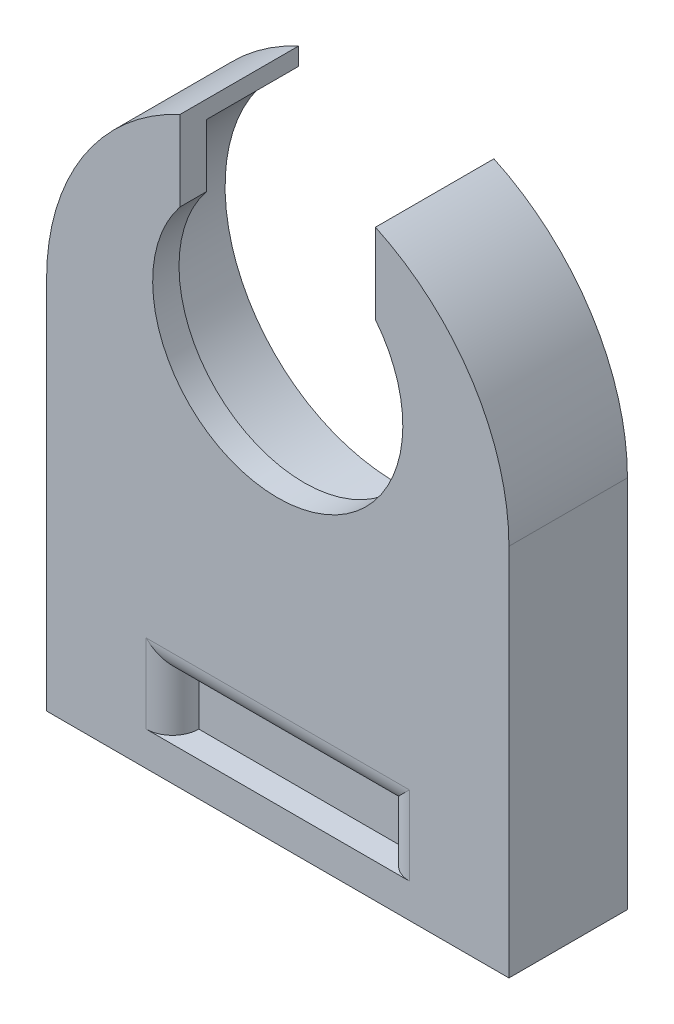
ISO-10303-21;
HEADER;
FILE_DESCRIPTION(('STEP AP214'),'2;1');
FILE_NAME('part.step','',(''),(''),'','','');
FILE_SCHEMA(('AUTOMOTIVE_DESIGN { 1 0 10303 214 1 1 1 1 }'));
ENDSEC;
DATA;
#1=APPLICATION_CONTEXT('core data for automotive mechanical design processes');
#2=APPLICATION_PROTOCOL_DEFINITION('international standard','automotive_design',2000,#1);
#3=PRODUCT_CONTEXT('',#1,'mechanical');
#4=PRODUCT('Part','Part','',(#3));
#5=PRODUCT_RELATED_PRODUCT_CATEGORY('part','',(#4));
#6=PRODUCT_DEFINITION_FORMATION('','',#4);
#7=PRODUCT_DEFINITION_CONTEXT('part definition',#1,'design');
#8=PRODUCT_DEFINITION('design','',#6,#7);
#9=PRODUCT_DEFINITION_SHAPE('','',#8);
#10=(LENGTH_UNIT() NAMED_UNIT(*) SI_UNIT(.MILLI.,.METRE.));
#11=(NAMED_UNIT(*) PLANE_ANGLE_UNIT() SI_UNIT($,.RADIAN.));
#12=(NAMED_UNIT(*) SI_UNIT($,.STERADIAN.) SOLID_ANGLE_UNIT());
#13=UNCERTAINTY_MEASURE_WITH_UNIT(LENGTH_MEASURE(1.E-05),#10,'distance_accuracy_value','');
#14=(GEOMETRIC_REPRESENTATION_CONTEXT(3) GLOBAL_UNCERTAINTY_ASSIGNED_CONTEXT((#13)) GLOBAL_UNIT_ASSIGNED_CONTEXT((#10,
#11,#12)) REPRESENTATION_CONTEXT('',''));
#15=CARTESIAN_POINT('',(0.,0.,0.));
#16=DIRECTION('',(0.,0.,1.));
#17=DIRECTION('',(1.,0.,0.));
#18=AXIS2_PLACEMENT_3D('',#15,#16,#17);
#19=CARTESIAN_POINT('',(8.78,8.5,3.5));
#20=DIRECTION('',(0.,0.,-1.));
#21=DIRECTION('',(-1.,0.,0.));
#22=AXIS2_PLACEMENT_3D('',#19,#20,#21);
#23=CYLINDRICAL_SURFACE('',#22,6.5);
#24=CARTESIAN_POINT('',(8.78,8.5,3.5));
#25=DIRECTION('',(0.,0.,1.));
#26=DIRECTION('',(1.,0.,0.));
#27=AXIS2_PLACEMENT_3D('',#24,#25,#26);
#28=CIRCLE('',#27,6.5);
#29=CARTESIAN_POINT('',(5.07,13.8372183766453,3.5));
#30=VERTEX_POINT('',#29);
#31=CARTESIAN_POINT('',(12.49,13.8372183766453,3.5));
#32=VERTEX_POINT('',#31);
#33=EDGE_CURVE('E150',#30,#32,#28,.T.);
#34=ORIENTED_EDGE('',*,*,#33,.T.);
#35=DIRECTION('',(0.,0.,-1.));
#36=VECTOR('',#35,1.);
#37=CARTESIAN_POINT('',(12.49,13.8372183766453,3.5));
#38=LINE('',#37,#36);
#39=CARTESIAN_POINT('',(12.49,13.8372183766453,0.));
#40=VERTEX_POINT('',#39);
#41=EDGE_CURVE('E136',#32,#40,#38,.T.);
#42=ORIENTED_EDGE('',*,*,#41,.T.);
#43=CARTESIAN_POINT('',(8.78,8.5,0.));
#44=DIRECTION('',(0.,0.,1.));
#45=DIRECTION('',(1.,0.,0.));
#46=AXIS2_PLACEMENT_3D('',#43,#44,#45);
#47=CIRCLE('',#46,6.5);
#48=CARTESIAN_POINT('',(5.07,13.8372183766453,0.));
#49=VERTEX_POINT('',#48);
#50=EDGE_CURVE('E148',#49,#40,#47,.T.);
#51=ORIENTED_EDGE('',*,*,#50,.F.);
#52=DIRECTION('',(0.,0.,-1.));
#53=VECTOR('',#52,1.);
#54=CARTESIAN_POINT('',(5.07,13.8372183766453,3.5));
#55=LINE('',#54,#53);
#56=EDGE_CURVE('E210',#49,#30,#55,.F.);
#57=ORIENTED_EDGE('',*,*,#56,.T.);
#58=EDGE_LOOP('',(#34,#42,#51,#57));
#59=FACE_BOUND('',#58,.T.);
#60=ADVANCED_FACE('F34',(#59),#23,.F.);
#61=CARTESIAN_POINT('',(0.,0.,0.));
#62=DIRECTION('',(0.,0.,1.));
#63=DIRECTION('',(1.,0.,0.));
#64=AXIS2_PLACEMENT_3D('',#61,#62,#63);
#65=PLANE('',#64);
#66=DIRECTION('',(0.,1.,0.));
#67=VECTOR('',#66,1.);
#68=CARTESIAN_POINT('',(12.49,14.6194981256581,0.));
#69=LINE('',#68,#67);
#70=CARTESIAN_POINT('',(12.49,14.5076566902575,0.));
#71=VERTEX_POINT('',#70);
#72=EDGE_CURVE('E133',#40,#71,#69,.T.);
#73=ORIENTED_EDGE('',*,*,#72,.T.);
#74=CARTESIAN_POINT('',(8.78,6.55,0.));
#75=DIRECTION('',(0.,0.,1.));
#76=DIRECTION('',(1.,0.,0.));
#77=AXIS2_PLACEMENT_3D('',#74,#75,#76);
#78=CIRCLE('',#77,8.78);
#79=CARTESIAN_POINT('',(17.56,6.55,0.));
#80=VERTEX_POINT('',#79);
#81=EDGE_CURVE('E172',#80,#71,#78,.T.);
#82=ORIENTED_EDGE('',*,*,#81,.F.);
#83=DIRECTION('',(0.,1.,0.));
#84=VECTOR('',#83,1.);
#85=CARTESIAN_POINT('',(17.56,0.,0.));
#86=LINE('',#85,#84);
#87=CARTESIAN_POINT('',(17.56,-7.65,0.));
#88=VERTEX_POINT('',#87);
#89=EDGE_CURVE('E170',#88,#80,#86,.T.);
#90=ORIENTED_EDGE('',*,*,#89,.F.);
#91=DIRECTION('',(1.,0.,0.));
#92=VECTOR('',#91,1.);
#93=CARTESIAN_POINT('',(0.,-7.65,0.));
#94=LINE('',#93,#92);
#95=CARTESIAN_POINT('',(0.,-7.65,0.));
#96=VERTEX_POINT('',#95);
#97=EDGE_CURVE('E234',#96,#88,#94,.T.);
#98=ORIENTED_EDGE('',*,*,#97,.F.);
#99=DIRECTION('',(0.,1.,0.));
#100=VECTOR('',#99,1.);
#101=CARTESIAN_POINT('',(0.,0.,0.));
#102=LINE('',#101,#100);
#103=CARTESIAN_POINT('',(0.,6.55,0.));
#104=VERTEX_POINT('',#103);
#105=EDGE_CURVE('E161',#96,#104,#102,.T.);
#106=ORIENTED_EDGE('',*,*,#105,.T.);
#107=CARTESIAN_POINT('',(8.78,6.55,0.));
#108=DIRECTION('',(0.,0.,1.));
#109=DIRECTION('',(1.,0.,0.));
#110=AXIS2_PLACEMENT_3D('',#107,#108,#109);
#111=CIRCLE('',#110,8.78);
#112=CARTESIAN_POINT('',(5.07,14.5076566902575,0.));
#113=VERTEX_POINT('',#112);
#114=EDGE_CURVE('E158',#113,#104,#111,.T.);
#115=ORIENTED_EDGE('',*,*,#114,.F.);
#116=DIRECTION('',(0.,1.,0.));
#117=VECTOR('',#116,1.);
#118=CARTESIAN_POINT('',(5.07,14.6194981256581,0.));
#119=LINE('',#118,#117);
#120=EDGE_CURVE('E157',#49,#113,#119,.T.);
#121=ORIENTED_EDGE('',*,*,#120,.F.);
#122=ORIENTED_EDGE('',*,*,#50,.T.);
#123=EDGE_LOOP('',(#73,#82,#90,#98,#106,#115,#121,#122));
#124=FACE_BOUND('',#123,.T.);
#125=ADVANCED_FACE('F155',(#124),#65,.F.);
#126=CARTESIAN_POINT('',(0.,0.,3.5));
#127=DIRECTION('',(0.,0.,1.));
#128=DIRECTION('',(1.,0.,0.));
#129=AXIS2_PLACEMENT_3D('',#126,#127,#128);
#130=PLANE('',#129);
#131=DIRECTION('',(0.,-1.,0.));
#132=VECTOR('',#131,1.);
#133=CARTESIAN_POINT('',(12.49,0.,3.5));
#134=LINE('',#133,#132);
#135=CARTESIAN_POINT('',(12.49,11.466209702634,3.5));
#136=VERTEX_POINT('',#135);
#137=EDGE_CURVE('E152',#32,#136,#134,.T.);
#138=ORIENTED_EDGE('',*,*,#137,.F.);
#139=ORIENTED_EDGE('',*,*,#33,.F.);
#140=DIRECTION('',(0.,1.,0.));
#141=VECTOR('',#140,1.);
#142=CARTESIAN_POINT('',(5.07,0.,3.5));
#143=LINE('',#142,#141);
#144=CARTESIAN_POINT('',(5.07,11.466209702634,3.5));
#145=VERTEX_POINT('',#144);
#146=EDGE_CURVE('E204',#145,#30,#143,.T.);
#147=ORIENTED_EDGE('',*,*,#146,.F.);
#148=CARTESIAN_POINT('',(8.78,8.5,3.5));
#149=DIRECTION('',(0.,0.,-1.));
#150=DIRECTION('',(-1.,0.,0.));
#151=AXIS2_PLACEMENT_3D('',#148,#149,#150);
#152=CIRCLE('',#151,4.75);
#153=EDGE_CURVE('E209',#136,#145,#152,.T.);
#154=ORIENTED_EDGE('',*,*,#153,.F.);
#155=EDGE_LOOP('',(#138,#139,#147,#154));
#156=FACE_BOUND('',#155,.T.);
#157=ADVANCED_FACE('F208',(#156),#130,.F.);
#158=CARTESIAN_POINT('',(0.,0.,4.5));
#159=DIRECTION('',(0.,0.,1.));
#160=DIRECTION('',(1.,0.,0.));
#161=AXIS2_PLACEMENT_3D('',#158,#159,#160);
#162=PLANE('',#161);
#163=DIRECTION('',(0.,1.,0.));
#164=VECTOR('',#163,1.);
#165=CARTESIAN_POINT('',(13.78,-6.35316683145248,4.5));
#166=LINE('',#165,#164);
#167=CARTESIAN_POINT('',(13.78,-3.35316683145248,4.5));
#168=VERTEX_POINT('',#167);
#169=CARTESIAN_POINT('',(13.78,-6.35316683145248,4.5));
#170=VERTEX_POINT('',#169);
#171=EDGE_CURVE('E182',#168,#170,#166,.F.);
#172=ORIENTED_EDGE('',*,*,#171,.T.);
#173=DIRECTION('',(1.,0.,0.));
#174=VECTOR('',#173,1.);
#175=CARTESIAN_POINT('',(12.78,-6.35316683145248,4.5));
#176=LINE('',#175,#174);
#177=CARTESIAN_POINT('',(3.78,-6.35316683145248,4.5));
#178=VERTEX_POINT('',#177);
#179=EDGE_CURVE('E198',#178,#170,#176,.T.);
#180=ORIENTED_EDGE('',*,*,#179,.F.);
#181=DIRECTION('',(0.,-1.,0.));
#182=VECTOR('',#181,1.);
#183=CARTESIAN_POINT('',(3.78,-4.35316683145248,4.5));
#184=LINE('',#183,#182);
#185=CARTESIAN_POINT('',(3.78,-3.35316683145248,4.5));
#186=VERTEX_POINT('',#185);
#187=EDGE_CURVE('E185',#178,#186,#184,.F.);
#188=ORIENTED_EDGE('',*,*,#187,.T.);
#189=DIRECTION('',(-1.,0.,0.));
#190=VECTOR('',#189,1.);
#191=CARTESIAN_POINT('',(12.78,-3.35316683145248,4.5));
#192=LINE('',#191,#190);
#193=EDGE_CURVE('E180',#186,#168,#192,.F.);
#194=ORIENTED_EDGE('',*,*,#193,.T.);
#195=EDGE_LOOP('',(#172,#180,#188,#194));
#196=FACE_BOUND('',#195,.T.);
#197=CARTESIAN_POINT('',(8.78,6.55,4.5));
#198=DIRECTION('',(0.,0.,1.));
#199=DIRECTION('',(1.,0.,0.));
#200=AXIS2_PLACEMENT_3D('',#197,#198,#199);
#201=CIRCLE('',#200,8.78);
#202=CARTESIAN_POINT('',(17.56,6.55,4.5));
#203=VERTEX_POINT('',#202);
#204=CARTESIAN_POINT('',(12.49,14.5076566902575,4.5));
#205=VERTEX_POINT('',#204);
#206=EDGE_CURVE('E241',#203,#205,#201,.T.);
#207=ORIENTED_EDGE('',*,*,#206,.T.);
#208=DIRECTION('',(0.,-1.,0.));
#209=VECTOR('',#208,1.);
#210=CARTESIAN_POINT('',(12.49,14.6194981256581,4.5));
#211=LINE('',#210,#209);
#212=CARTESIAN_POINT('',(12.49,11.466209702634,4.5));
#213=VERTEX_POINT('',#212);
#214=EDGE_CURVE('E48',#205,#213,#211,.T.);
#215=ORIENTED_EDGE('',*,*,#214,.T.);
#216=CARTESIAN_POINT('',(8.78,8.5,4.5));
#217=DIRECTION('',(0.,0.,-1.));
#218=DIRECTION('',(-1.,0.,0.));
#219=AXIS2_PLACEMENT_3D('',#216,#217,#218);
#220=CIRCLE('',#219,4.75);
#221=CARTESIAN_POINT('',(5.07,11.466209702634,4.5));
#222=VERTEX_POINT('',#221);
#223=EDGE_CURVE('E55',#213,#222,#220,.T.);
#224=ORIENTED_EDGE('',*,*,#223,.T.);
#225=DIRECTION('',(0.,-1.,0.));
#226=VECTOR('',#225,1.);
#227=CARTESIAN_POINT('',(5.07,14.6194981256581,4.5));
#228=LINE('',#227,#226);
#229=CARTESIAN_POINT('',(5.07,14.5076566902575,4.5));
#230=VERTEX_POINT('',#229);
#231=EDGE_CURVE('E151',#230,#222,#228,.T.);
#232=ORIENTED_EDGE('',*,*,#231,.F.);
#233=CARTESIAN_POINT('',(8.78,6.55,4.5));
#234=DIRECTION('',(0.,0.,1.));
#235=DIRECTION('',(1.,0.,0.));
#236=AXIS2_PLACEMENT_3D('',#233,#234,#235);
#237=CIRCLE('',#236,8.78);
#238=CARTESIAN_POINT('',(0.,6.55,4.5));
#239=VERTEX_POINT('',#238);
#240=EDGE_CURVE('E245',#230,#239,#237,.T.);
#241=ORIENTED_EDGE('',*,*,#240,.T.);
#242=DIRECTION('',(0.,-1.,0.));
#243=VECTOR('',#242,1.);
#244=CARTESIAN_POINT('',(0.,0.,4.5));
#245=LINE('',#244,#243);
#246=CARTESIAN_POINT('',(0.,-7.65,4.5));
#247=VERTEX_POINT('',#246);
#248=EDGE_CURVE('E164',#239,#247,#245,.T.);
#249=ORIENTED_EDGE('',*,*,#248,.T.);
#250=DIRECTION('',(-1.,0.,0.));
#251=VECTOR('',#250,1.);
#252=CARTESIAN_POINT('',(17.56,-7.65,4.5));
#253=LINE('',#252,#251);
#254=CARTESIAN_POINT('',(17.56,-7.65,4.5));
#255=VERTEX_POINT('',#254);
#256=EDGE_CURVE('E227',#255,#247,#253,.T.);
#257=ORIENTED_EDGE('',*,*,#256,.F.);
#258=DIRECTION('',(0.,1.,0.));
#259=VECTOR('',#258,1.);
#260=CARTESIAN_POINT('',(17.56,0.,4.5));
#261=LINE('',#260,#259);
#262=EDGE_CURVE('E159',#255,#203,#261,.T.);
#263=ORIENTED_EDGE('',*,*,#262,.T.);
#264=EDGE_LOOP('',(#207,#215,#224,#232,#241,#249,#257,#263));
#265=FACE_BOUND('',#264,.T.);
#266=ADVANCED_FACE('F250',(#196,#265),#162,.T.);
#267=CARTESIAN_POINT('',(8.78,8.5,4.5));
#268=DIRECTION('',(0.,0.,-1.));
#269=DIRECTION('',(-1.,0.,0.));
#270=AXIS2_PLACEMENT_3D('',#267,#268,#269);
#271=CYLINDRICAL_SURFACE('',#270,4.75);
#272=DIRECTION('',(0.,0.,-1.));
#273=VECTOR('',#272,1.);
#274=CARTESIAN_POINT('',(12.49,11.466209702634,4.5));
#275=LINE('',#274,#273);
#276=EDGE_CURVE('E142',#136,#213,#275,.F.);
#277=ORIENTED_EDGE('',*,*,#276,.F.);
#278=ORIENTED_EDGE('',*,*,#153,.T.);
#279=DIRECTION('',(0.,0.,-1.));
#280=VECTOR('',#279,1.);
#281=CARTESIAN_POINT('',(5.07,11.466209702634,4.5));
#282=LINE('',#281,#280);
#283=EDGE_CURVE('E42',#222,#145,#282,.T.);
#284=ORIENTED_EDGE('',*,*,#283,.F.);
#285=ORIENTED_EDGE('',*,*,#223,.F.);
#286=EDGE_LOOP('',(#277,#278,#284,#285));
#287=FACE_BOUND('',#286,.T.);
#288=ADVANCED_FACE('F271',(#287),#271,.F.);
#289=CARTESIAN_POINT('',(8.78,6.55,3.5));
#290=DIRECTION('',(0.,0.,-1.));
#291=DIRECTION('',(-1.,0.,0.));
#292=AXIS2_PLACEMENT_3D('',#289,#290,#291);
#293=CYLINDRICAL_SURFACE('',#292,8.78);
#294=DIRECTION('',(0.,0.,-1.));
#295=VECTOR('',#294,1.);
#296=CARTESIAN_POINT('',(12.49,14.5076566902575,3.5));
#297=LINE('',#296,#295);
#298=EDGE_CURVE('E11',#205,#71,#297,.T.);
#299=ORIENTED_EDGE('',*,*,#298,.F.);
#300=ORIENTED_EDGE('',*,*,#206,.F.);
#301=DIRECTION('',(0.,0.,-1.));
#302=VECTOR('',#301,1.);
#303=CARTESIAN_POINT('',(17.56,6.55,3.5));
#304=LINE('',#303,#302);
#305=EDGE_CURVE('E174',#203,#80,#304,.T.);
#306=ORIENTED_EDGE('',*,*,#305,.T.);
#307=ORIENTED_EDGE('',*,*,#81,.T.);
#308=EDGE_LOOP('',(#299,#300,#306,#307));
#309=FACE_BOUND('',#308,.T.);
#310=ADVANCED_FACE('F263',(#309),#293,.T.);
#311=CARTESIAN_POINT('',(8.78,6.55,3.5));
#312=DIRECTION('',(0.,0.,-1.));
#313=DIRECTION('',(-1.,0.,0.));
#314=AXIS2_PLACEMENT_3D('',#311,#312,#313);
#315=CYLINDRICAL_SURFACE('',#314,8.78);
#316=DIRECTION('',(0.,0.,-1.));
#317=VECTOR('',#316,1.);
#318=CARTESIAN_POINT('',(5.07,14.5076566902575,3.5));
#319=LINE('',#318,#317);
#320=EDGE_CURVE('E196',#113,#230,#319,.F.);
#321=ORIENTED_EDGE('',*,*,#320,.F.);
#322=ORIENTED_EDGE('',*,*,#114,.T.);
#323=DIRECTION('',(0.,0.,-1.));
#324=VECTOR('',#323,1.);
#325=CARTESIAN_POINT('',(0.,6.55,3.5));
#326=LINE('',#325,#324);
#327=EDGE_CURVE('E177',#239,#104,#326,.T.);
#328=ORIENTED_EDGE('',*,*,#327,.F.);
#329=ORIENTED_EDGE('',*,*,#240,.F.);
#330=EDGE_LOOP('',(#321,#322,#328,#329));
#331=FACE_BOUND('',#330,.T.);
#332=ADVANCED_FACE('F266',(#331),#315,.T.);
#333=CARTESIAN_POINT('',(0.,0.,3.5));
#334=DIRECTION('',(-1.,0.,0.));
#335=DIRECTION('',(0.,0.,1.));
#336=AXIS2_PLACEMENT_3D('',#333,#334,#335);
#337=PLANE('',#336);
#338=ORIENTED_EDGE('',*,*,#105,.F.);
#339=DIRECTION('',(0.,0.,-1.));
#340=VECTOR('',#339,1.);
#341=CARTESIAN_POINT('',(0.,-7.65,4.5));
#342=LINE('',#341,#340);
#343=EDGE_CURVE('E231',#247,#96,#342,.T.);
#344=ORIENTED_EDGE('',*,*,#343,.F.);
#345=ORIENTED_EDGE('',*,*,#248,.F.);
#346=ORIENTED_EDGE('',*,*,#327,.T.);
#347=EDGE_LOOP('',(#338,#344,#345,#346));
#348=FACE_BOUND('',#347,.T.);
#349=ADVANCED_FACE('F254',(#348),#337,.T.);
#350=CARTESIAN_POINT('',(17.56,0.,3.5));
#351=DIRECTION('',(-1.,0.,0.));
#352=DIRECTION('',(0.,0.,1.));
#353=AXIS2_PLACEMENT_3D('',#350,#351,#352);
#354=PLANE('',#353);
#355=ORIENTED_EDGE('',*,*,#89,.T.);
#356=ORIENTED_EDGE('',*,*,#305,.F.);
#357=ORIENTED_EDGE('',*,*,#262,.F.);
#358=DIRECTION('',(0.,0.,1.));
#359=VECTOR('',#358,1.);
#360=CARTESIAN_POINT('',(17.56,-7.65,0.));
#361=LINE('',#360,#359);
#362=EDGE_CURVE('E237',#88,#255,#361,.T.);
#363=ORIENTED_EDGE('',*,*,#362,.F.);
#364=EDGE_LOOP('',(#355,#356,#357,#363));
#365=FACE_BOUND('',#364,.T.);
#366=ADVANCED_FACE('F260',(#365),#354,.F.);
#367=CARTESIAN_POINT('',(0.,-7.65,0.));
#368=DIRECTION('',(0.,-1.,0.));
#369=DIRECTION('',(0.,0.,-1.));
#370=AXIS2_PLACEMENT_3D('',#367,#368,#369);
#371=PLANE('',#370);
#372=ORIENTED_EDGE('',*,*,#256,.T.);
#373=ORIENTED_EDGE('',*,*,#343,.T.);
#374=ORIENTED_EDGE('',*,*,#97,.T.);
#375=ORIENTED_EDGE('',*,*,#362,.T.);
#376=EDGE_LOOP('',(#372,#373,#374,#375));
#377=FACE_BOUND('',#376,.T.);
#378=ADVANCED_FACE('F257',(#377),#371,.T.);
#379=CARTESIAN_POINT('',(12.78,-6.35316683145248,3.5));
#380=DIRECTION('',(0.,-1.,0.));
#381=DIRECTION('',(1.,0.,0.));
#382=AXIS2_PLACEMENT_3D('',#379,#380,#381);
#383=PLANE('',#382);
#384=ORIENTED_EDGE('',*,*,#179,.T.);
#385=CARTESIAN_POINT('',(13.78,-6.35316683145248,3.5));
#386=DIRECTION('',(0.,-1.,0.));
#387=DIRECTION('',(1.,0.,0.));
#388=AXIS2_PLACEMENT_3D('',#385,#386,#387);
#389=CIRCLE('',#388,1.);
#390=CARTESIAN_POINT('',(12.78,-6.35316683145248,3.5));
#391=VERTEX_POINT('',#390);
#392=EDGE_CURVE('E190',#170,#391,#389,.T.);
#393=ORIENTED_EDGE('',*,*,#392,.T.);
#394=DIRECTION('',(1.,0.,0.));
#395=VECTOR('',#394,1.);
#396=CARTESIAN_POINT('',(12.78,-6.35316683145248,3.5));
#397=LINE('',#396,#395);
#398=CARTESIAN_POINT('',(4.78,-6.35316683145248,3.5));
#399=VERTEX_POINT('',#398);
#400=EDGE_CURVE('E224',#399,#391,#397,.T.);
#401=ORIENTED_EDGE('',*,*,#400,.F.);
#402=CARTESIAN_POINT('',(3.78,-6.35316683145248,3.5));
#403=DIRECTION('',(0.,-1.,0.));
#404=DIRECTION('',(1.,0.,0.));
#405=AXIS2_PLACEMENT_3D('',#402,#403,#404);
#406=CIRCLE('',#405,1.);
#407=EDGE_CURVE('E187',#399,#178,#406,.T.);
#408=ORIENTED_EDGE('',*,*,#407,.T.);
#409=EDGE_LOOP('',(#384,#393,#401,#408));
#410=FACE_BOUND('',#409,.T.);
#411=ADVANCED_FACE('F314',(#410),#383,.F.);
#412=CARTESIAN_POINT('',(0.,0.,3.5));
#413=DIRECTION('',(0.,0.,1.));
#414=DIRECTION('',(1.,0.,0.));
#415=AXIS2_PLACEMENT_3D('',#412,#413,#414);
#416=PLANE('',#415);
#417=DIRECTION('',(0.,1.,0.));
#418=VECTOR('',#417,1.);
#419=CARTESIAN_POINT('',(12.78,-6.35316683145248,3.5));
#420=LINE('',#419,#418);
#421=CARTESIAN_POINT('',(12.78,-4.35316683145248,3.5));
#422=VERTEX_POINT('',#421);
#423=EDGE_CURVE('E217',#391,#422,#420,.T.);
#424=ORIENTED_EDGE('',*,*,#423,.T.);
#425=DIRECTION('',(-1.,0.,0.));
#426=VECTOR('',#425,1.);
#427=CARTESIAN_POINT('',(12.78,-4.35316683145248,3.5));
#428=LINE('',#427,#426);
#429=CARTESIAN_POINT('',(4.78,-4.35316683145248,3.5));
#430=VERTEX_POINT('',#429);
#431=EDGE_CURVE('E219',#422,#430,#428,.T.);
#432=ORIENTED_EDGE('',*,*,#431,.T.);
#433=DIRECTION('',(0.,-1.,0.));
#434=VECTOR('',#433,1.);
#435=CARTESIAN_POINT('',(4.78,-6.35316683145248,3.5));
#436=LINE('',#435,#434);
#437=EDGE_CURVE('E221',#430,#399,#436,.T.);
#438=ORIENTED_EDGE('',*,*,#437,.T.);
#439=ORIENTED_EDGE('',*,*,#400,.T.);
#440=EDGE_LOOP('',(#424,#432,#438,#439));
#441=FACE_BOUND('',#440,.T.);
#442=ADVANCED_FACE('F300',(#441),#416,.T.);
#443=CARTESIAN_POINT('',(13.78,-6.35316683145248,3.5));
#444=DIRECTION('',(0.,-1.,0.));
#445=DIRECTION('',(0.,0.,-1.));
#446=AXIS2_PLACEMENT_3D('',#443,#444,#445);
#447=CYLINDRICAL_SURFACE('',#446,1.);
#448=ORIENTED_EDGE('',*,*,#392,.F.);
#449=ORIENTED_EDGE('',*,*,#171,.F.);
#450=CARTESIAN_POINT('',(13.78,-3.35316683145248,3.5));
#451=DIRECTION('',(0.707106781186547,-0.707106781186547,0.));
#452=DIRECTION('',(-0.707106781186547,-0.707106781186547,0.));
#453=AXIS2_PLACEMENT_3D('',#450,#451,#452);
#454=ELLIPSE('',#453,1.41421356237309,1.);
#455=EDGE_CURVE('E195',#422,#168,#454,.F.);
#456=ORIENTED_EDGE('',*,*,#455,.F.);
#457=ORIENTED_EDGE('',*,*,#423,.F.);
#458=EDGE_LOOP('',(#448,#449,#456,#457));
#459=FACE_BOUND('',#458,.T.);
#460=ADVANCED_FACE('F36',(#459),#447,.T.);
#461=CARTESIAN_POINT('',(12.78,-3.35316683145248,3.5));
#462=DIRECTION('',(1.,0.,0.));
#463=DIRECTION('',(0.,0.,-1.));
#464=AXIS2_PLACEMENT_3D('',#461,#462,#463);
#465=CYLINDRICAL_SURFACE('',#464,1.);
#466=ORIENTED_EDGE('',*,*,#455,.T.);
#467=ORIENTED_EDGE('',*,*,#193,.F.);
#468=CARTESIAN_POINT('',(3.78,-3.35316683145248,3.5));
#469=DIRECTION('',(0.707106781186547,0.707106781186547,0.));
#470=DIRECTION('',(-0.707106781186547,0.707106781186547,0.));
#471=AXIS2_PLACEMENT_3D('',#468,#469,#470);
#472=ELLIPSE('',#471,1.41421356237309,1.);
#473=EDGE_CURVE('E192',#430,#186,#472,.F.);
#474=ORIENTED_EDGE('',*,*,#473,.F.);
#475=ORIENTED_EDGE('',*,*,#431,.F.);
#476=EDGE_LOOP('',(#466,#467,#474,#475));
#477=FACE_BOUND('',#476,.T.);
#478=ADVANCED_FACE('F293',(#477),#465,.T.);
#479=CARTESIAN_POINT('',(3.78,-6.35316683145248,3.5));
#480=DIRECTION('',(0.,1.,0.));
#481=DIRECTION('',(0.,0.,1.));
#482=AXIS2_PLACEMENT_3D('',#479,#480,#481);
#483=CYLINDRICAL_SURFACE('',#482,1.);
#484=ORIENTED_EDGE('',*,*,#473,.T.);
#485=ORIENTED_EDGE('',*,*,#187,.F.);
#486=ORIENTED_EDGE('',*,*,#407,.F.);
#487=ORIENTED_EDGE('',*,*,#437,.F.);
#488=EDGE_LOOP('',(#484,#485,#486,#487));
#489=FACE_BOUND('',#488,.T.);
#490=ADVANCED_FACE('F291',(#489),#483,.T.);
#491=CARTESIAN_POINT('',(5.07,0.,0.));
#492=DIRECTION('',(1.,0.,0.));
#493=DIRECTION('',(0.,0.,-1.));
#494=AXIS2_PLACEMENT_3D('',#491,#492,#493);
#495=PLANE('',#494);
#496=ORIENTED_EDGE('',*,*,#320,.T.);
#497=ORIENTED_EDGE('',*,*,#231,.T.);
#498=ORIENTED_EDGE('',*,*,#283,.T.);
#499=ORIENTED_EDGE('',*,*,#146,.T.);
#500=ORIENTED_EDGE('',*,*,#56,.F.);
#501=ORIENTED_EDGE('',*,*,#120,.T.);
#502=EDGE_LOOP('',(#496,#497,#498,#499,#500,#501));
#503=FACE_BOUND('',#502,.T.);
#504=ADVANCED_FACE('F203',(#503),#495,.T.);
#505=CARTESIAN_POINT('',(12.49,0.,0.));
#506=DIRECTION('',(-1.,0.,0.));
#507=DIRECTION('',(0.,0.,-1.));
#508=AXIS2_PLACEMENT_3D('',#505,#506,#507);
#509=PLANE('',#508);
#510=ORIENTED_EDGE('',*,*,#137,.T.);
#511=ORIENTED_EDGE('',*,*,#276,.T.);
#512=ORIENTED_EDGE('',*,*,#214,.F.);
#513=ORIENTED_EDGE('',*,*,#298,.T.);
#514=ORIENTED_EDGE('',*,*,#72,.F.);
#515=ORIENTED_EDGE('',*,*,#41,.F.);
#516=EDGE_LOOP('',(#510,#511,#512,#513,#514,#515));
#517=FACE_BOUND('',#516,.T.);
#518=ADVANCED_FACE('F135',(#517),#509,.T.);
#519=CLOSED_SHELL('',(#60,#125,#157,#266,#288,#310,#332,#349,#366,#378,#411,#442,#460,#478,#490,
#504,#518));
#520=MANIFOLD_SOLID_BREP('B2',#519);
#521=ADVANCED_BREP_SHAPE_REPRESENTATION('',(#18,#520),#14);
#522=SHAPE_DEFINITION_REPRESENTATION(#9,#521);
ENDSEC;
END-ISO-10303-21;
